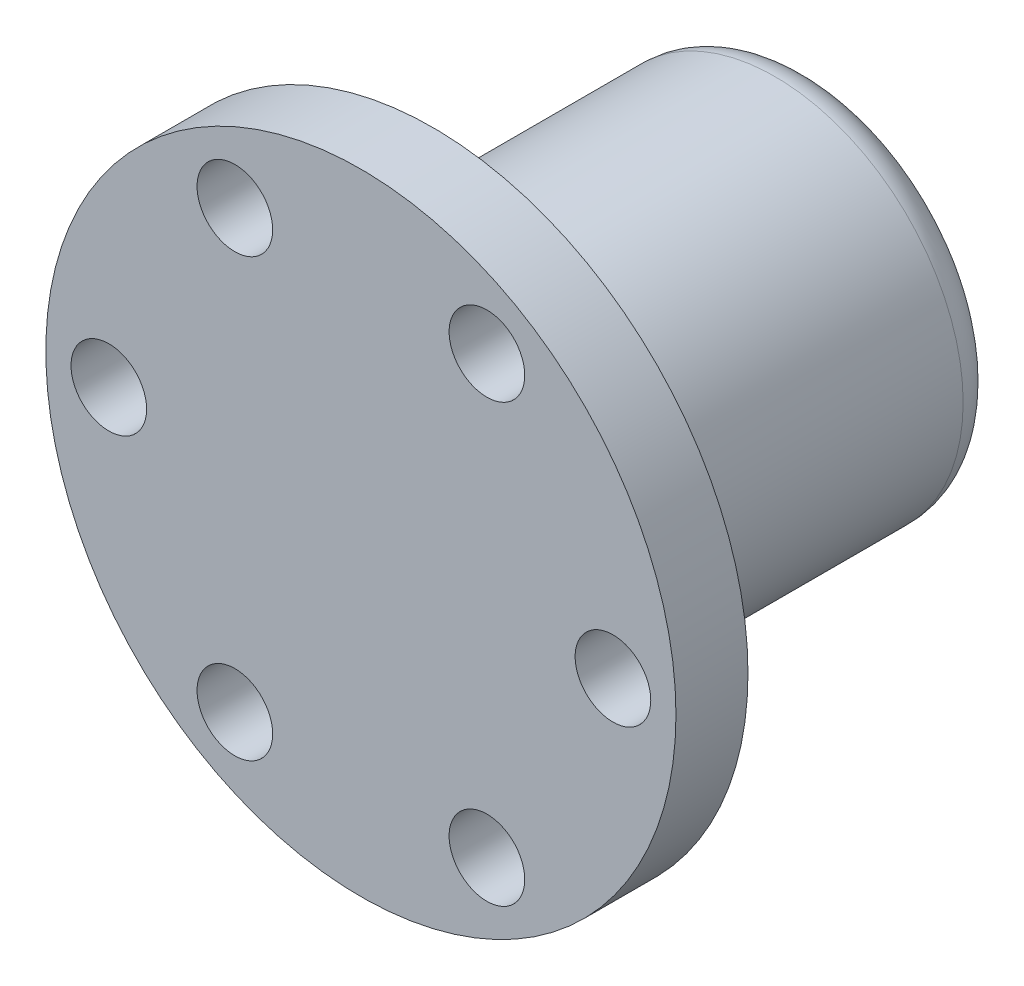
ISO-10303-21;
HEADER;
FILE_DESCRIPTION(('STEP AP214'),'2;1');
FILE_NAME('part.step','',(''),(''),'','','');
FILE_SCHEMA(('AUTOMOTIVE_DESIGN { 1 0 10303 214 1 1 1 1 }'));
ENDSEC;
DATA;
#1=APPLICATION_CONTEXT('core data for automotive mechanical design processes');
#2=APPLICATION_PROTOCOL_DEFINITION('international standard','automotive_design',2000,#1);
#3=PRODUCT_CONTEXT('',#1,'mechanical');
#4=PRODUCT('Part','Part','',(#3));
#5=PRODUCT_RELATED_PRODUCT_CATEGORY('part','',(#4));
#6=PRODUCT_DEFINITION_FORMATION('','',#4);
#7=PRODUCT_DEFINITION_CONTEXT('part definition',#1,'design');
#8=PRODUCT_DEFINITION('design','',#6,#7);
#9=PRODUCT_DEFINITION_SHAPE('','',#8);
#10=(LENGTH_UNIT() NAMED_UNIT(*) SI_UNIT(.MILLI.,.METRE.));
#11=(NAMED_UNIT(*) PLANE_ANGLE_UNIT() SI_UNIT($,.RADIAN.));
#12=(NAMED_UNIT(*) SI_UNIT($,.STERADIAN.) SOLID_ANGLE_UNIT());
#13=UNCERTAINTY_MEASURE_WITH_UNIT(LENGTH_MEASURE(1.E-05),#10,'distance_accuracy_value','');
#14=(GEOMETRIC_REPRESENTATION_CONTEXT(3) GLOBAL_UNCERTAINTY_ASSIGNED_CONTEXT((#13)) GLOBAL_UNIT_ASSIGNED_CONTEXT((#10,
#11,#12)) REPRESENTATION_CONTEXT('',''));
#15=CARTESIAN_POINT('',(0.,0.,0.));
#16=DIRECTION('',(0.,0.,1.));
#17=DIRECTION('',(1.,0.,0.));
#18=AXIS2_PLACEMENT_3D('',#15,#16,#17);
#19=CARTESIAN_POINT('',(0.,0.,21.));
#20=DIRECTION('',(0.,0.,-1.));
#21=DIRECTION('',(-1.,0.,0.));
#22=AXIS2_PLACEMENT_3D('',#19,#20,#21);
#23=CYLINDRICAL_SURFACE('',#22,10.45);
#24=CARTESIAN_POINT('',(0.,0.,2.));
#25=DIRECTION('',(0.,0.,1.));
#26=DIRECTION('',(1.,0.,0.));
#27=AXIS2_PLACEMENT_3D('',#24,#25,#26);
#28=CIRCLE('',#27,10.45);
#29=CARTESIAN_POINT('',(-10.45,0.,1.99999999999999));
#30=VERTEX_POINT('',#29);
#31=EDGE_CURVE('E45',#30,#30,#28,.T.);
#32=CARTESIAN_POINT('',(0.,0.,21.));
#33=DIRECTION('',(0.,0.,1.));
#34=DIRECTION('',(1.,0.,0.));
#35=AXIS2_PLACEMENT_3D('',#32,#33,#34);
#36=CIRCLE('',#35,10.45);
#37=CARTESIAN_POINT('',(-10.45,0.,21.));
#38=VERTEX_POINT('',#37);
#39=EDGE_CURVE('E50',#38,#38,#36,.T.);
#40=CARTESIAN_POINT('',(-10.45,0.,1.99999999999999));
#41=CARTESIAN_POINT('',(-10.45,0.,2.19791666666666));
#42=CARTESIAN_POINT('',(-10.45,0.,2.39583333333333));
#43=CARTESIAN_POINT('',(-10.45,0.,2.79166666666666));
#44=CARTESIAN_POINT('',(-10.45,0.,2.98958333333333));
#45=CARTESIAN_POINT('',(-10.45,0.,3.38541666666666));
#46=CARTESIAN_POINT('',(-10.45,0.,3.58333333333333));
#47=CARTESIAN_POINT('',(-10.45,0.,3.97916666666666));
#48=CARTESIAN_POINT('',(-10.45,0.,4.17708333333333));
#49=CARTESIAN_POINT('',(-10.45,0.,4.57291666666666));
#50=CARTESIAN_POINT('',(-10.45,0.,4.77083333333333));
#51=CARTESIAN_POINT('',(-10.45,0.,5.16666666666666));
#52=CARTESIAN_POINT('',(-10.45,0.,5.36458333333333));
#53=CARTESIAN_POINT('',(-10.45,0.,5.76041666666666));
#54=CARTESIAN_POINT('',(-10.45,0.,5.95833333333333));
#55=CARTESIAN_POINT('',(-10.45,0.,6.35416666666666));
#56=CARTESIAN_POINT('',(-10.45,0.,6.55208333333333));
#57=CARTESIAN_POINT('',(-10.45,0.,6.94791666666666));
#58=CARTESIAN_POINT('',(-10.45,0.,7.14583333333333));
#59=CARTESIAN_POINT('',(-10.45,0.,7.54166666666666));
#60=CARTESIAN_POINT('',(-10.45,0.,7.73958333333333));
#61=CARTESIAN_POINT('',(-10.45,0.,8.13541666666666));
#62=CARTESIAN_POINT('',(-10.45,0.,8.33333333333333));
#63=CARTESIAN_POINT('',(-10.45,0.,8.72916666666666));
#64=CARTESIAN_POINT('',(-10.45,0.,8.92708333333333));
#65=CARTESIAN_POINT('',(-10.45,0.,9.32291666666666));
#66=CARTESIAN_POINT('',(-10.45,0.,9.52083333333333));
#67=CARTESIAN_POINT('',(-10.45,0.,9.91666666666666));
#68=CARTESIAN_POINT('',(-10.45,0.,10.1145833333333));
#69=CARTESIAN_POINT('',(-10.45,0.,10.5104166666667));
#70=CARTESIAN_POINT('',(-10.45,0.,10.7083333333333));
#71=CARTESIAN_POINT('',(-10.45,0.,11.1041666666667));
#72=CARTESIAN_POINT('',(-10.45,0.,11.3020833333333));
#73=CARTESIAN_POINT('',(-10.45,0.,11.6979166666667));
#74=CARTESIAN_POINT('',(-10.45,0.,11.8958333333333));
#75=CARTESIAN_POINT('',(-10.45,0.,12.2916666666667));
#76=CARTESIAN_POINT('',(-10.45,0.,12.4895833333333));
#77=CARTESIAN_POINT('',(-10.45,0.,12.8854166666667));
#78=CARTESIAN_POINT('',(-10.45,0.,13.0833333333333));
#79=CARTESIAN_POINT('',(-10.45,0.,13.4791666666667));
#80=CARTESIAN_POINT('',(-10.45,0.,13.6770833333333));
#81=CARTESIAN_POINT('',(-10.45,0.,14.0729166666667));
#82=CARTESIAN_POINT('',(-10.45,0.,14.2708333333333));
#83=CARTESIAN_POINT('',(-10.45,0.,14.6666666666667));
#84=CARTESIAN_POINT('',(-10.45,0.,14.8645833333333));
#85=CARTESIAN_POINT('',(-10.45,0.,15.2604166666667));
#86=CARTESIAN_POINT('',(-10.45,0.,15.4583333333333));
#87=CARTESIAN_POINT('',(-10.45,0.,15.8541666666667));
#88=CARTESIAN_POINT('',(-10.45,0.,16.0520833333333));
#89=CARTESIAN_POINT('',(-10.45,0.,16.4479166666667));
#90=CARTESIAN_POINT('',(-10.45,0.,16.6458333333333));
#91=CARTESIAN_POINT('',(-10.45,0.,17.0416666666667));
#92=CARTESIAN_POINT('',(-10.45,0.,17.2395833333333));
#93=CARTESIAN_POINT('',(-10.45,0.,17.6354166666667));
#94=CARTESIAN_POINT('',(-10.45,0.,17.8333333333333));
#95=CARTESIAN_POINT('',(-10.45,0.,18.2291666666667));
#96=CARTESIAN_POINT('',(-10.45,0.,18.4270833333333));
#97=CARTESIAN_POINT('',(-10.45,0.,18.8229166666667));
#98=CARTESIAN_POINT('',(-10.45,0.,19.0208333333333));
#99=CARTESIAN_POINT('',(-10.45,0.,19.4166666666667));
#100=CARTESIAN_POINT('',(-10.45,0.,19.6145833333333));
#101=CARTESIAN_POINT('',(-10.45,0.,20.0104166666667));
#102=CARTESIAN_POINT('',(-10.45,0.,20.2083333333333));
#103=CARTESIAN_POINT('',(-10.45,0.,20.6041666666667));
#104=CARTESIAN_POINT('',(-10.45,0.,20.8020833333333));
#105=CARTESIAN_POINT('',(-10.45,0.,21.));
#106=B_SPLINE_CURVE_WITH_KNOTS('',3,(#40,#41,#42,#43,#44,#45,#46,#47,#48,#49,#50,#51,#52,#53,
#54,#55,#56,#57,#58,#59,#60,#61,#62,#63,#64,#65,#66,#67,#68,#69,#70,#71,#72,#73,#74,#75,#76,#77,
#78,#79,#80,#81,#82,#83,#84,#85,#86,#87,#88,#89,#90,#91,#92,#93,#94,#95,#96,#97,#98,#99,#100,
#101,#102,#103,#104,#105),.UNSPECIFIED.,.F.,.F.,(4,2,2,2,2,2,2,2,2,2,2,2,2,2,2,2,2,2,2,2,2,2,2,
2,2,2,2,2,2,2,2,2,4),(0.,0.593750000000001,1.1875,1.78125,2.375,2.96875,3.5625,4.15625,4.75,
5.34375,5.9375,6.53125,7.125,7.71875,8.3125,8.90625,9.5,10.09375,10.6875,11.28125,11.875,
12.46875,13.0625,13.65625,14.25,14.84375,15.4375,16.03125,16.625,17.21875,17.8125,18.40625,19.),.UNSPECIFIED.);
#107=EDGE_CURVE('BSEAM37',#30,#38,#106,.T.);
#108=ORIENTED_EDGE('',*,*,#31,.T.);
#109=ORIENTED_EDGE('',*,*,#39,.F.);
#110=ORIENTED_EDGE('',*,*,#107,.T.);
#111=ORIENTED_EDGE('',*,*,#107,.F.);
#112=EDGE_LOOP('',(#108,#110,#109,#111));
#113=FACE_BOUND('',#112,.T.);
#114=ADVANCED_FACE('F37',(#113),#23,.T.);
#115=CARTESIAN_POINT('',(0.,0.,0.));
#116=DIRECTION('',(0.,0.,1.));
#117=DIRECTION('',(1.,0.,0.));
#118=AXIS2_PLACEMENT_3D('',#115,#116,#117);
#119=PLANE('',#118);
#120=CARTESIAN_POINT('',(0.,0.,0.));
#121=DIRECTION('',(0.,0.,1.));
#122=DIRECTION('',(1.,0.,0.));
#123=AXIS2_PLACEMENT_3D('',#120,#121,#122);
#124=CIRCLE('',#123,8.45);
#125=CARTESIAN_POINT('',(8.45,0.,0.));
#126=VERTEX_POINT('',#125);
#127=EDGE_CURVE('E10',#126,#126,#124,.F.);
#128=ORIENTED_EDGE('',*,*,#127,.T.);
#129=EDGE_LOOP('',(#128));
#130=FACE_BOUND('',#129,.T.);
#131=ADVANCED_FACE('F137',(#130),#119,.F.);
#132=CARTESIAN_POINT('',(0.,0.,25.));
#133=DIRECTION('',(0.,0.,-1.));
#134=DIRECTION('',(-1.,0.,0.));
#135=AXIS2_PLACEMENT_3D('',#132,#133,#134);
#136=CYLINDRICAL_SURFACE('',#135,17.5);
#137=CARTESIAN_POINT('',(0.,0.,25.));
#138=DIRECTION('',(0.,0.,1.));
#139=DIRECTION('',(1.,0.,0.));
#140=AXIS2_PLACEMENT_3D('',#137,#138,#139);
#141=CIRCLE('',#140,17.5);
#142=CARTESIAN_POINT('',(17.5,0.,25.));
#143=VERTEX_POINT('',#142);
#144=EDGE_CURVE('E55',#143,#143,#141,.T.);
#145=ORIENTED_EDGE('',*,*,#144,.F.);
#146=EDGE_LOOP('',(#145));
#147=FACE_BOUND('',#146,.T.);
#148=CARTESIAN_POINT('',(0.,0.,21.));
#149=DIRECTION('',(0.,0.,1.));
#150=DIRECTION('',(1.,0.,0.));
#151=AXIS2_PLACEMENT_3D('',#148,#149,#150);
#152=CIRCLE('',#151,17.5);
#153=CARTESIAN_POINT('',(17.5,0.,21.));
#154=VERTEX_POINT('',#153);
#155=EDGE_CURVE('E62',#154,#154,#152,.T.);
#156=ORIENTED_EDGE('',*,*,#155,.T.);
#157=EDGE_LOOP('',(#156));
#158=FACE_BOUND('',#157,.T.);
#159=ADVANCED_FACE('F121',(#147,#158),#136,.T.);
#160=CARTESIAN_POINT('',(0.,0.,25.));
#161=DIRECTION('',(0.,0.,1.));
#162=DIRECTION('',(1.,0.,0.));
#163=AXIS2_PLACEMENT_3D('',#160,#161,#162);
#164=PLANE('',#163);
#165=CARTESIAN_POINT('',(14.,0.,25.));
#166=DIRECTION('',(0.,0.,1.));
#167=DIRECTION('',(1.,0.,0.));
#168=AXIS2_PLACEMENT_3D('',#165,#166,#167);
#169=CIRCLE('',#168,2.1);
#170=CARTESIAN_POINT('',(16.1,0.,25.));
#171=VERTEX_POINT('',#170);
#172=EDGE_CURVE('E82',#171,#171,#169,.T.);
#173=ORIENTED_EDGE('',*,*,#172,.F.);
#174=EDGE_LOOP('',(#173));
#175=FACE_BOUND('',#174,.T.);
#176=CARTESIAN_POINT('',(7.00000000000014,12.1243556529821,25.));
#177=DIRECTION('',(0.,0.,1.));
#178=DIRECTION('',(1.,0.,0.));
#179=AXIS2_PLACEMENT_3D('',#176,#177,#178);
#180=CIRCLE('',#179,2.1);
#181=CARTESIAN_POINT('',(9.10000000000014,12.1243556529821,25.));
#182=VERTEX_POINT('',#181);
#183=EDGE_CURVE('E95',#182,#182,#180,.T.);
#184=ORIENTED_EDGE('',*,*,#183,.F.);
#185=EDGE_LOOP('',(#184));
#186=FACE_BOUND('',#185,.T.);
#187=CARTESIAN_POINT('',(-6.99999999999989,12.1243556529822,25.));
#188=DIRECTION('',(0.,0.,1.));
#189=DIRECTION('',(1.,0.,0.));
#190=AXIS2_PLACEMENT_3D('',#187,#188,#189);
#191=CIRCLE('',#190,2.1);
#192=CARTESIAN_POINT('',(-4.89999999999989,12.1243556529822,25.));
#193=VERTEX_POINT('',#192);
#194=EDGE_CURVE('E90',#193,#193,#191,.T.);
#195=ORIENTED_EDGE('',*,*,#194,.F.);
#196=EDGE_LOOP('',(#195));
#197=FACE_BOUND('',#196,.T.);
#198=CARTESIAN_POINT('',(-14.,0.,25.));
#199=DIRECTION('',(0.,0.,1.));
#200=DIRECTION('',(1.,0.,0.));
#201=AXIS2_PLACEMENT_3D('',#198,#199,#200);
#202=CIRCLE('',#201,2.1);
#203=CARTESIAN_POINT('',(-11.9,0.,25.));
#204=VERTEX_POINT('',#203);
#205=EDGE_CURVE('E94',#204,#204,#202,.T.);
#206=ORIENTED_EDGE('',*,*,#205,.F.);
#207=EDGE_LOOP('',(#206));
#208=FACE_BOUND('',#207,.T.);
#209=CARTESIAN_POINT('',(-7.00000000000006,-12.1243556529821,25.));
#210=DIRECTION('',(0.,0.,1.));
#211=DIRECTION('',(1.,0.,0.));
#212=AXIS2_PLACEMENT_3D('',#209,#210,#211);
#213=CIRCLE('',#212,2.1);
#214=CARTESIAN_POINT('',(-4.90000000000006,-12.1243556529821,25.));
#215=VERTEX_POINT('',#214);
#216=EDGE_CURVE('E99',#215,#215,#213,.T.);
#217=ORIENTED_EDGE('',*,*,#216,.F.);
#218=EDGE_LOOP('',(#217));
#219=FACE_BOUND('',#218,.T.);
#220=CARTESIAN_POINT('',(6.99999999999997,-12.1243556529822,25.));
#221=DIRECTION('',(0.,0.,1.));
#222=DIRECTION('',(1.,0.,0.));
#223=AXIS2_PLACEMENT_3D('',#220,#221,#222);
#224=CIRCLE('',#223,2.1);
#225=CARTESIAN_POINT('',(9.09999999999997,-12.1243556529822,25.));
#226=VERTEX_POINT('',#225);
#227=EDGE_CURVE('E103',#226,#226,#224,.T.);
#228=ORIENTED_EDGE('',*,*,#227,.F.);
#229=EDGE_LOOP('',(#228));
#230=FACE_BOUND('',#229,.T.);
#231=ORIENTED_EDGE('',*,*,#144,.T.);
#232=EDGE_LOOP('',(#231));
#233=FACE_BOUND('',#232,.T.);
#234=ADVANCED_FACE('F117',(#175,#186,#197,#208,#219,#230,#233),#164,.T.);
#235=CARTESIAN_POINT('',(0.,0.,21.));
#236=DIRECTION('',(0.,0.,1.));
#237=DIRECTION('',(1.,0.,0.));
#238=AXIS2_PLACEMENT_3D('',#235,#236,#237);
#239=PLANE('',#238);
#240=CARTESIAN_POINT('',(14.,0.,21.));
#241=DIRECTION('',(0.,0.,1.));
#242=DIRECTION('',(1.,0.,0.));
#243=AXIS2_PLACEMENT_3D('',#240,#241,#242);
#244=CIRCLE('',#243,2.1);
#245=CARTESIAN_POINT('',(16.1,0.,21.));
#246=VERTEX_POINT('',#245);
#247=EDGE_CURVE('E58',#246,#246,#244,.T.);
#248=ORIENTED_EDGE('',*,*,#247,.T.);
#249=EDGE_LOOP('',(#248));
#250=FACE_BOUND('',#249,.T.);
#251=CARTESIAN_POINT('',(7.00000000000014,12.1243556529821,21.));
#252=DIRECTION('',(0.,0.,1.));
#253=DIRECTION('',(1.,0.,0.));
#254=AXIS2_PLACEMENT_3D('',#251,#252,#253);
#255=CIRCLE('',#254,2.1);
#256=CARTESIAN_POINT('',(9.10000000000014,12.1243556529821,21.));
#257=VERTEX_POINT('',#256);
#258=EDGE_CURVE('E63',#257,#257,#255,.T.);
#259=ORIENTED_EDGE('',*,*,#258,.T.);
#260=EDGE_LOOP('',(#259));
#261=FACE_BOUND('',#260,.T.);
#262=CARTESIAN_POINT('',(-6.99999999999989,12.1243556529822,21.));
#263=DIRECTION('',(0.,0.,1.));
#264=DIRECTION('',(1.,0.,0.));
#265=AXIS2_PLACEMENT_3D('',#262,#263,#264);
#266=CIRCLE('',#265,2.1);
#267=CARTESIAN_POINT('',(-4.89999999999989,12.1243556529822,21.));
#268=VERTEX_POINT('',#267);
#269=EDGE_CURVE('E67',#268,#268,#266,.T.);
#270=ORIENTED_EDGE('',*,*,#269,.T.);
#271=EDGE_LOOP('',(#270));
#272=FACE_BOUND('',#271,.T.);
#273=CARTESIAN_POINT('',(-14.,0.,21.));
#274=DIRECTION('',(0.,0.,1.));
#275=DIRECTION('',(1.,0.,0.));
#276=AXIS2_PLACEMENT_3D('',#273,#274,#275);
#277=CIRCLE('',#276,2.1);
#278=CARTESIAN_POINT('',(-11.9,0.,21.));
#279=VERTEX_POINT('',#278);
#280=EDGE_CURVE('E71',#279,#279,#277,.T.);
#281=ORIENTED_EDGE('',*,*,#280,.T.);
#282=EDGE_LOOP('',(#281));
#283=FACE_BOUND('',#282,.T.);
#284=CARTESIAN_POINT('',(-7.00000000000006,-12.1243556529821,21.));
#285=DIRECTION('',(0.,0.,1.));
#286=DIRECTION('',(1.,0.,0.));
#287=AXIS2_PLACEMENT_3D('',#284,#285,#286);
#288=CIRCLE('',#287,2.1);
#289=CARTESIAN_POINT('',(-4.90000000000006,-12.1243556529821,21.));
#290=VERTEX_POINT('',#289);
#291=EDGE_CURVE('E75',#290,#290,#288,.T.);
#292=ORIENTED_EDGE('',*,*,#291,.T.);
#293=EDGE_LOOP('',(#292));
#294=FACE_BOUND('',#293,.T.);
#295=CARTESIAN_POINT('',(6.99999999999997,-12.1243556529822,21.));
#296=DIRECTION('',(0.,0.,1.));
#297=DIRECTION('',(1.,0.,0.));
#298=AXIS2_PLACEMENT_3D('',#295,#296,#297);
#299=CIRCLE('',#298,2.1);
#300=CARTESIAN_POINT('',(9.09999999999997,-12.1243556529822,21.));
#301=VERTEX_POINT('',#300);
#302=EDGE_CURVE('E79',#301,#301,#299,.T.);
#303=ORIENTED_EDGE('',*,*,#302,.T.);
#304=EDGE_LOOP('',(#303));
#305=FACE_BOUND('',#304,.T.);
#306=ORIENTED_EDGE('',*,*,#39,.T.);
#307=EDGE_LOOP('',(#306));
#308=FACE_BOUND('',#307,.T.);
#309=ORIENTED_EDGE('',*,*,#155,.F.);
#310=EDGE_LOOP('',(#309));
#311=FACE_BOUND('',#310,.T.);
#312=ADVANCED_FACE('F120',(#250,#261,#272,#283,#294,#305,#308,#311),#239,.F.);
#313=CARTESIAN_POINT('',(6.99999999999997,-12.1243556529822,0.));
#314=DIRECTION('',(0.,0.,1.));
#315=DIRECTION('',(1.,0.,0.));
#316=AXIS2_PLACEMENT_3D('',#313,#314,#315);
#317=CYLINDRICAL_SURFACE('',#316,2.1);
#318=ORIENTED_EDGE('',*,*,#227,.T.);
#319=EDGE_LOOP('',(#318));
#320=FACE_BOUND('',#319,.T.);
#321=ORIENTED_EDGE('',*,*,#302,.F.);
#322=EDGE_LOOP('',(#321));
#323=FACE_BOUND('',#322,.T.);
#324=ADVANCED_FACE('F142',(#320,#323),#317,.F.);
#325=CARTESIAN_POINT('',(-7.00000000000006,-12.1243556529821,0.));
#326=DIRECTION('',(0.,0.,1.));
#327=DIRECTION('',(1.,0.,0.));
#328=AXIS2_PLACEMENT_3D('',#325,#326,#327);
#329=CYLINDRICAL_SURFACE('',#328,2.1);
#330=ORIENTED_EDGE('',*,*,#216,.T.);
#331=EDGE_LOOP('',(#330));
#332=FACE_BOUND('',#331,.T.);
#333=ORIENTED_EDGE('',*,*,#291,.F.);
#334=EDGE_LOOP('',(#333));
#335=FACE_BOUND('',#334,.T.);
#336=ADVANCED_FACE('F148',(#332,#335),#329,.F.);
#337=CARTESIAN_POINT('',(-14.,0.,0.));
#338=DIRECTION('',(0.,0.,1.));
#339=DIRECTION('',(1.,0.,0.));
#340=AXIS2_PLACEMENT_3D('',#337,#338,#339);
#341=CYLINDRICAL_SURFACE('',#340,2.1);
#342=ORIENTED_EDGE('',*,*,#205,.T.);
#343=EDGE_LOOP('',(#342));
#344=FACE_BOUND('',#343,.T.);
#345=ORIENTED_EDGE('',*,*,#280,.F.);
#346=EDGE_LOOP('',(#345));
#347=FACE_BOUND('',#346,.T.);
#348=ADVANCED_FACE('F190',(#344,#347),#341,.F.);
#349=CARTESIAN_POINT('',(-6.99999999999989,12.1243556529822,0.));
#350=DIRECTION('',(0.,0.,1.));
#351=DIRECTION('',(1.,0.,0.));
#352=AXIS2_PLACEMENT_3D('',#349,#350,#351);
#353=CYLINDRICAL_SURFACE('',#352,2.1);
#354=ORIENTED_EDGE('',*,*,#194,.T.);
#355=EDGE_LOOP('',(#354));
#356=FACE_BOUND('',#355,.T.);
#357=ORIENTED_EDGE('',*,*,#269,.F.);
#358=EDGE_LOOP('',(#357));
#359=FACE_BOUND('',#358,.T.);
#360=ADVANCED_FACE('F200',(#356,#359),#353,.F.);
#361=CARTESIAN_POINT('',(7.00000000000014,12.1243556529821,0.));
#362=DIRECTION('',(0.,0.,1.));
#363=DIRECTION('',(1.,0.,0.));
#364=AXIS2_PLACEMENT_3D('',#361,#362,#363);
#365=CYLINDRICAL_SURFACE('',#364,2.1);
#366=ORIENTED_EDGE('',*,*,#183,.T.);
#367=EDGE_LOOP('',(#366));
#368=FACE_BOUND('',#367,.T.);
#369=ORIENTED_EDGE('',*,*,#258,.F.);
#370=EDGE_LOOP('',(#369));
#371=FACE_BOUND('',#370,.T.);
#372=ADVANCED_FACE('F210',(#368,#371),#365,.F.);
#373=CARTESIAN_POINT('',(14.,0.,0.));
#374=DIRECTION('',(0.,0.,1.));
#375=DIRECTION('',(1.,0.,0.));
#376=AXIS2_PLACEMENT_3D('',#373,#374,#375);
#377=CYLINDRICAL_SURFACE('',#376,2.1);
#378=ORIENTED_EDGE('',*,*,#172,.T.);
#379=EDGE_LOOP('',(#378));
#380=FACE_BOUND('',#379,.T.);
#381=ORIENTED_EDGE('',*,*,#247,.F.);
#382=EDGE_LOOP('',(#381));
#383=FACE_BOUND('',#382,.T.);
#384=ADVANCED_FACE('F114',(#380,#383),#377,.F.);
#385=CARTESIAN_POINT('',(0.,0.,2.));
#386=DIRECTION('',(0.,0.,1.));
#387=DIRECTION('',(1.,0.,0.));
#388=AXIS2_PLACEMENT_3D('',#385,#386,#387);
#389=TOROIDAL_SURFACE('',#388,8.45,2.);
#390=ORIENTED_EDGE('',*,*,#127,.F.);
#391=EDGE_LOOP('',(#390));
#392=FACE_BOUND('',#391,.T.);
#393=ORIENTED_EDGE('',*,*,#31,.F.);
#394=EDGE_LOOP('',(#393));
#395=FACE_BOUND('',#394,.T.);
#396=ADVANCED_FACE('F39',(#392,#395),#389,.T.);
#397=CLOSED_SHELL('',(#114,#131,#159,#234,#312,#324,#336,#348,#360,#372,#384,#396));
#398=MANIFOLD_SOLID_BREP('B2',#397);
#399=ADVANCED_BREP_SHAPE_REPRESENTATION('',(#18,#398),#14);
#400=SHAPE_DEFINITION_REPRESENTATION(#9,#399);
ENDSEC;
END-ISO-10303-21;
